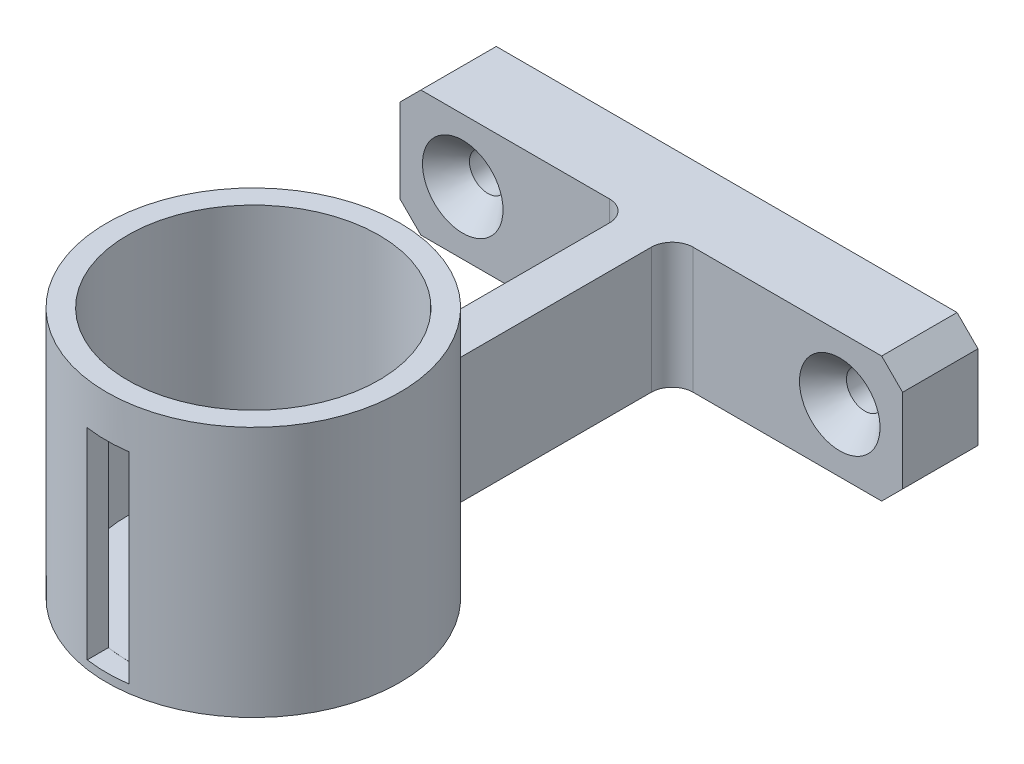
ISO-10303-21;
HEADER;
FILE_DESCRIPTION(('STEP AP214'),'2;1');
FILE_NAME('part.step','',(''),(''),'','','');
FILE_SCHEMA(('AUTOMOTIVE_DESIGN { 1 0 10303 214 1 1 1 1 }'));
ENDSEC;
DATA;
#1=APPLICATION_CONTEXT('core data for automotive mechanical design processes');
#2=APPLICATION_PROTOCOL_DEFINITION('international standard','automotive_design',2000,#1);
#3=PRODUCT_CONTEXT('',#1,'mechanical');
#4=PRODUCT('Part','Part','',(#3));
#5=PRODUCT_RELATED_PRODUCT_CATEGORY('part','',(#4));
#6=PRODUCT_DEFINITION_FORMATION('','',#4);
#7=PRODUCT_DEFINITION_CONTEXT('part definition',#1,'design');
#8=PRODUCT_DEFINITION('design','',#6,#7);
#9=PRODUCT_DEFINITION_SHAPE('','',#8);
#10=(LENGTH_UNIT() NAMED_UNIT(*) SI_UNIT(.MILLI.,.METRE.));
#11=(NAMED_UNIT(*) PLANE_ANGLE_UNIT() SI_UNIT($,.RADIAN.));
#12=(NAMED_UNIT(*) SI_UNIT($,.STERADIAN.) SOLID_ANGLE_UNIT());
#13=UNCERTAINTY_MEASURE_WITH_UNIT(LENGTH_MEASURE(1.E-05),#10,'distance_accuracy_value','');
#14=(GEOMETRIC_REPRESENTATION_CONTEXT(3) GLOBAL_UNCERTAINTY_ASSIGNED_CONTEXT((#13)) GLOBAL_UNIT_ASSIGNED_CONTEXT((#10,
#11,#12)) REPRESENTATION_CONTEXT('',''));
#15=CARTESIAN_POINT('',(0.,0.,0.));
#16=DIRECTION('',(0.,0.,1.));
#17=DIRECTION('',(1.,0.,0.));
#18=AXIS2_PLACEMENT_3D('',#15,#16,#17);
#19=CARTESIAN_POINT('',(30.,-14.,56.5));
#20=DIRECTION('',(0.,-1.,0.));
#21=DIRECTION('',(0.,0.,-1.));
#22=AXIS2_PLACEMENT_3D('',#19,#20,#21);
#23=CYLINDRICAL_SURFACE('',#22,15.);
#24=CARTESIAN_POINT('',(30.,-14.,56.5));
#25=DIRECTION('',(0.,-1.,0.));
#26=DIRECTION('',(0.,0.,-1.));
#27=AXIS2_PLACEMENT_3D('',#24,#25,#26);
#28=CIRCLE('',#27,15.);
#29=CARTESIAN_POINT('',(30.,-14.,41.5));
#30=VERTEX_POINT('',#29);
#31=EDGE_CURVE('E11',#30,#30,#28,.T.);
#32=ORIENTED_EDGE('',*,*,#31,.T.);
#33=EDGE_LOOP('',(#32));
#34=FACE_BOUND('',#33,.T.);
#35=CARTESIAN_POINT('',(30.,-15.,56.5));
#36=DIRECTION('',(0.,-1.,0.));
#37=DIRECTION('',(0.,0.,-1.));
#38=AXIS2_PLACEMENT_3D('',#35,#36,#37);
#39=CIRCLE('',#38,15.);
#40=CARTESIAN_POINT('',(30.,-15.,41.5));
#41=VERTEX_POINT('',#40);
#42=EDGE_CURVE('E57',#41,#41,#39,.T.);
#43=ORIENTED_EDGE('',*,*,#42,.F.);
#44=EDGE_LOOP('',(#43));
#45=FACE_BOUND('',#44,.T.);
#46=ADVANCED_FACE('F54',(#34,#45),#23,.T.);
#47=CARTESIAN_POINT('',(30.,-14.,56.5));
#48=DIRECTION('',(0.,-1.,0.));
#49=DIRECTION('',(0.,0.,-1.));
#50=AXIS2_PLACEMENT_3D('',#47,#48,#49);
#51=PLANE('',#50);
#52=CARTESIAN_POINT('',(30.,-14.,56.5));
#53=DIRECTION('',(0.,-1.,0.));
#54=DIRECTION('',(0.,0.,-1.));
#55=AXIS2_PLACEMENT_3D('',#52,#53,#54);
#56=CIRCLE('',#55,1.5);
#57=CARTESIAN_POINT('',(30.,-14.,55.));
#58=VERTEX_POINT('',#57);
#59=EDGE_CURVE('E67',#58,#58,#56,.T.);
#60=ORIENTED_EDGE('',*,*,#59,.T.);
#61=EDGE_LOOP('',(#60));
#62=FACE_BOUND('',#61,.T.);
#63=ORIENTED_EDGE('',*,*,#31,.F.);
#64=EDGE_LOOP('',(#63));
#65=FACE_BOUND('',#64,.T.);
#66=ADVANCED_FACE('F76',(#62,#65),#51,.F.);
#67=CARTESIAN_POINT('',(30.,-15.,56.5));
#68=DIRECTION('',(0.,-1.,0.));
#69=DIRECTION('',(0.,0.,-1.));
#70=AXIS2_PLACEMENT_3D('',#67,#68,#69);
#71=PLANE('',#70);
#72=CARTESIAN_POINT('',(30.,-15.,56.5));
#73=DIRECTION('',(0.,-1.,0.));
#74=DIRECTION('',(0.,0.,-1.));
#75=AXIS2_PLACEMENT_3D('',#72,#73,#74);
#76=CIRCLE('',#75,1.5);
#77=CARTESIAN_POINT('',(30.,-15.,55.));
#78=VERTEX_POINT('',#77);
#79=EDGE_CURVE('E69',#78,#78,#76,.T.);
#80=ORIENTED_EDGE('',*,*,#79,.F.);
#81=EDGE_LOOP('',(#80));
#82=FACE_BOUND('',#81,.T.);
#83=ORIENTED_EDGE('',*,*,#42,.T.);
#84=EDGE_LOOP('',(#83));
#85=FACE_BOUND('',#84,.T.);
#86=ADVANCED_FACE('F82',(#82,#85),#71,.T.);
#87=CARTESIAN_POINT('',(30.,-14.,56.5));
#88=DIRECTION('',(0.,-1.,0.));
#89=DIRECTION('',(0.,0.,-1.));
#90=AXIS2_PLACEMENT_3D('',#87,#88,#89);
#91=CYLINDRICAL_SURFACE('',#90,1.5);
#92=ORIENTED_EDGE('',*,*,#59,.F.);
#93=EDGE_LOOP('',(#92));
#94=FACE_BOUND('',#93,.T.);
#95=ORIENTED_EDGE('',*,*,#79,.T.);
#96=EDGE_LOOP('',(#95));
#97=FACE_BOUND('',#96,.T.);
#98=ADVANCED_FACE('F79',(#94,#97),#91,.F.);
#99=CLOSED_SHELL('',(#46,#66,#86,#98));
#100=MANIFOLD_SOLID_BREP('B2',#99);
#101=CARTESIAN_POINT('',(0.,0.,9.));
#102=DIRECTION('',(0.,0.,1.));
#103=DIRECTION('',(1.,0.,0.));
#104=AXIS2_PLACEMENT_3D('',#101,#102,#103);
#105=PLANE('',#104);
#106=DIRECTION('',(1.,0.,0.));
#107=VECTOR('',#106,1.);
#108=CARTESIAN_POINT('',(0.,-15.,9.));
#109=LINE('',#108,#107);
#110=CARTESIAN_POINT('',(35.,-15.,9.));
#111=VERTEX_POINT('',#110);
#112=CARTESIAN_POINT('',(57.5,-15.,9.));
#113=VERTEX_POINT('',#112);
#114=EDGE_CURVE('E366',#111,#113,#109,.T.);
#115=ORIENTED_EDGE('',*,*,#114,.T.);
#116=DIRECTION('',(-0.707106781186548,-0.707106781186548,0.));
#117=VECTOR('',#116,1.);
#118=CARTESIAN_POINT('',(36.25,-36.25,9.));
#119=LINE('',#118,#117);
#120=CARTESIAN_POINT('',(60.,-12.5,9.));
#121=VERTEX_POINT('',#120);
#122=EDGE_CURVE('E477',#113,#121,#119,.F.);
#123=ORIENTED_EDGE('',*,*,#122,.T.);
#124=DIRECTION('',(0.,1.,0.));
#125=VECTOR('',#124,1.);
#126=CARTESIAN_POINT('',(60.,0.,9.));
#127=LINE('',#126,#125);
#128=CARTESIAN_POINT('',(60.,-2.49999999999999,9.));
#129=VERTEX_POINT('',#128);
#130=EDGE_CURVE('E371',#121,#129,#127,.T.);
#131=ORIENTED_EDGE('',*,*,#130,.T.);
#132=DIRECTION('',(0.707106781186548,-0.707106781186548,0.));
#133=VECTOR('',#132,1.);
#134=CARTESIAN_POINT('',(28.75,28.75,9.));
#135=LINE('',#134,#133);
#136=CARTESIAN_POINT('',(57.5,0.,9.));
#137=VERTEX_POINT('',#136);
#138=EDGE_CURVE('E474',#129,#137,#135,.F.);
#139=ORIENTED_EDGE('',*,*,#138,.T.);
#140=DIRECTION('',(-1.,0.,0.));
#141=VECTOR('',#140,1.);
#142=CARTESIAN_POINT('',(0.,0.,9.));
#143=LINE('',#142,#141);
#144=CARTESIAN_POINT('',(35.,0.,9.));
#145=VERTEX_POINT('',#144);
#146=EDGE_CURVE('E376',#137,#145,#143,.T.);
#147=ORIENTED_EDGE('',*,*,#146,.T.);
#148=DIRECTION('',(0.,1.,0.));
#149=VECTOR('',#148,1.);
#150=CARTESIAN_POINT('',(35.,0.,9.));
#151=LINE('',#150,#149);
#152=EDGE_CURVE('E415',#145,#111,#151,.F.);
#153=ORIENTED_EDGE('',*,*,#152,.T.);
#154=EDGE_LOOP('',(#115,#123,#131,#139,#147,#153));
#155=FACE_BOUND('',#154,.T.);
#156=CARTESIAN_POINT('',(52.5,-7.5,9.));
#157=DIRECTION('',(0.,0.,-1.));
#158=DIRECTION('',(-1.,0.,0.));
#159=AXIS2_PLACEMENT_3D('',#156,#157,#158);
#160=CIRCLE('',#159,4.80786021344867);
#161=CARTESIAN_POINT('',(47.6921397865513,-7.5,9.));
#162=VERTEX_POINT('',#161);
#163=EDGE_CURVE('E334',#162,#162,#160,.T.);
#164=ORIENTED_EDGE('',*,*,#163,.T.);
#165=EDGE_LOOP('',(#164));
#166=FACE_BOUND('',#165,.T.);
#167=ADVANCED_FACE('F125',(#155,#166),#105,.T.);
#168=CARTESIAN_POINT('',(25.,0.,9.));
#169=VERTEX_POINT('',#168);
#170=CARTESIAN_POINT('',(2.50000000000002,0.,9.));
#171=VERTEX_POINT('',#170);
#172=EDGE_CURVE('E375',#169,#171,#143,.T.);
#173=ORIENTED_EDGE('',*,*,#172,.T.);
#174=DIRECTION('',(0.707106781186548,0.707106781186548,0.));
#175=VECTOR('',#174,1.);
#176=CARTESIAN_POINT('',(1.25000000000001,-1.25000000000001,9.));
#177=LINE('',#176,#175);
#178=CARTESIAN_POINT('',(0.,-2.50000000000002,9.));
#179=VERTEX_POINT('',#178);
#180=EDGE_CURVE('E497',#171,#179,#177,.F.);
#181=ORIENTED_EDGE('',*,*,#180,.T.);
#182=DIRECTION('',(0.,-1.,0.));
#183=VECTOR('',#182,1.);
#184=CARTESIAN_POINT('',(0.,0.,9.));
#185=LINE('',#184,#183);
#186=CARTESIAN_POINT('',(0.,-12.5,9.));
#187=VERTEX_POINT('',#186);
#188=EDGE_CURVE('E362',#179,#187,#185,.T.);
#189=ORIENTED_EDGE('',*,*,#188,.T.);
#190=DIRECTION('',(-0.707106781186546,0.707106781186549,0.));
#191=VECTOR('',#190,1.);
#192=CARTESIAN_POINT('',(-6.24999999999999,-6.24999999999996,9.));
#193=LINE('',#192,#191);
#194=CARTESIAN_POINT('',(2.5,-15.,9.));
#195=VERTEX_POINT('',#194);
#196=EDGE_CURVE('E494',#187,#195,#193,.F.);
#197=ORIENTED_EDGE('',*,*,#196,.T.);
#198=CARTESIAN_POINT('',(25.,-15.,9.));
#199=VERTEX_POINT('',#198);
#200=EDGE_CURVE('E368',#195,#199,#109,.T.);
#201=ORIENTED_EDGE('',*,*,#200,.T.);
#202=DIRECTION('',(0.,-1.,0.));
#203=VECTOR('',#202,1.);
#204=CARTESIAN_POINT('',(25.,0.,9.));
#205=LINE('',#204,#203);
#206=EDGE_CURVE('E418',#199,#169,#205,.F.);
#207=ORIENTED_EDGE('',*,*,#206,.T.);
#208=EDGE_LOOP('',(#173,#181,#189,#197,#201,#207));
#209=FACE_BOUND('',#208,.T.);
#210=CARTESIAN_POINT('',(7.5,-7.5,9.));
#211=DIRECTION('',(0.,0.,1.));
#212=DIRECTION('',(1.,0.,0.));
#213=AXIS2_PLACEMENT_3D('',#210,#211,#212);
#214=CIRCLE('',#213,4.80786021344867);
#215=CARTESIAN_POINT('',(12.3078602134487,-7.5,9.));
#216=VERTEX_POINT('',#215);
#217=EDGE_CURVE('E345',#216,#216,#214,.T.);
#218=ORIENTED_EDGE('',*,*,#217,.F.);
#219=EDGE_LOOP('',(#218));
#220=FACE_BOUND('',#219,.T.);
#221=ADVANCED_FACE('F583',(#209,#220),#105,.T.);
#222=CARTESIAN_POINT('',(0.,0.,0.));
#223=DIRECTION('',(0.,0.,1.));
#224=DIRECTION('',(1.,0.,0.));
#225=AXIS2_PLACEMENT_3D('',#222,#223,#224);
#226=PLANE('',#225);
#227=DIRECTION('',(0.,1.,0.));
#228=VECTOR('',#227,1.);
#229=CARTESIAN_POINT('',(60.,0.,0.));
#230=LINE('',#229,#228);
#231=CARTESIAN_POINT('',(60.,-12.5,0.));
#232=VERTEX_POINT('',#231);
#233=CARTESIAN_POINT('',(60.,-2.49999999999999,0.));
#234=VERTEX_POINT('',#233);
#235=EDGE_CURVE('E387',#232,#234,#230,.T.);
#236=ORIENTED_EDGE('',*,*,#235,.F.);
#237=DIRECTION('',(0.707106781186548,0.707106781186548,0.));
#238=VECTOR('',#237,1.);
#239=CARTESIAN_POINT('',(60.,-12.5,0.));
#240=LINE('',#239,#238);
#241=CARTESIAN_POINT('',(57.5,-15.,0.));
#242=VERTEX_POINT('',#241);
#243=EDGE_CURVE('E464',#232,#242,#240,.F.);
#244=ORIENTED_EDGE('',*,*,#243,.T.);
#245=DIRECTION('',(1.,0.,0.));
#246=VECTOR('',#245,1.);
#247=CARTESIAN_POINT('',(0.,-15.,0.));
#248=LINE('',#247,#246);
#249=CARTESIAN_POINT('',(2.5,-15.,0.));
#250=VERTEX_POINT('',#249);
#251=EDGE_CURVE('E383',#250,#242,#248,.T.);
#252=ORIENTED_EDGE('',*,*,#251,.F.);
#253=DIRECTION('',(0.707106781186546,-0.707106781186549,0.));
#254=VECTOR('',#253,1.);
#255=CARTESIAN_POINT('',(2.5,-15.,0.));
#256=LINE('',#255,#254);
#257=CARTESIAN_POINT('',(0.,-12.5,0.));
#258=VERTEX_POINT('',#257);
#259=EDGE_CURVE('E455',#250,#258,#256,.F.);
#260=ORIENTED_EDGE('',*,*,#259,.T.);
#261=DIRECTION('',(0.,-1.,0.));
#262=VECTOR('',#261,1.);
#263=CARTESIAN_POINT('',(0.,0.,0.));
#264=LINE('',#263,#262);
#265=CARTESIAN_POINT('',(0.,-2.50000000000002,0.));
#266=VERTEX_POINT('',#265);
#267=EDGE_CURVE('E361',#266,#258,#264,.T.);
#268=ORIENTED_EDGE('',*,*,#267,.F.);
#269=DIRECTION('',(-0.707106781186548,-0.707106781186548,0.));
#270=VECTOR('',#269,1.);
#271=CARTESIAN_POINT('',(0.,-2.50000000000002,0.));
#272=LINE('',#271,#270);
#273=CARTESIAN_POINT('',(2.50000000000002,0.,0.));
#274=VERTEX_POINT('',#273);
#275=EDGE_CURVE('E458',#266,#274,#272,.F.);
#276=ORIENTED_EDGE('',*,*,#275,.T.);
#277=DIRECTION('',(-1.,0.,0.));
#278=VECTOR('',#277,1.);
#279=CARTESIAN_POINT('',(0.,0.,0.));
#280=LINE('',#279,#278);
#281=CARTESIAN_POINT('',(57.5,0.,0.));
#282=VERTEX_POINT('',#281);
#283=EDGE_CURVE('E367',#282,#274,#280,.T.);
#284=ORIENTED_EDGE('',*,*,#283,.F.);
#285=DIRECTION('',(-0.707106781186548,0.707106781186548,0.));
#286=VECTOR('',#285,1.);
#287=CARTESIAN_POINT('',(57.5,0.,0.));
#288=LINE('',#287,#286);
#289=EDGE_CURVE('E461',#282,#234,#288,.F.);
#290=ORIENTED_EDGE('',*,*,#289,.T.);
#291=EDGE_LOOP('',(#236,#244,#252,#260,#268,#276,#284,#290));
#292=FACE_BOUND('',#291,.T.);
#293=CARTESIAN_POINT('',(7.5,-7.5,0.));
#294=DIRECTION('',(0.,0.,1.));
#295=DIRECTION('',(1.,0.,0.));
#296=AXIS2_PLACEMENT_3D('',#293,#294,#295);
#297=CIRCLE('',#296,2.2);
#298=CARTESIAN_POINT('',(9.7,-7.5,0.));
#299=VERTEX_POINT('',#298);
#300=EDGE_CURVE('E357',#299,#299,#297,.T.);
#301=ORIENTED_EDGE('',*,*,#300,.T.);
#302=EDGE_LOOP('',(#301));
#303=FACE_BOUND('',#302,.T.);
#304=CARTESIAN_POINT('',(52.5,-7.5,0.));
#305=DIRECTION('',(0.,0.,1.));
#306=DIRECTION('',(-1.,0.,0.));
#307=AXIS2_PLACEMENT_3D('',#304,#305,#306);
#308=CIRCLE('',#307,2.2);
#309=CARTESIAN_POINT('',(50.3,-7.5,0.));
#310=VERTEX_POINT('',#309);
#311=EDGE_CURVE('E353',#310,#310,#308,.T.);
#312=ORIENTED_EDGE('',*,*,#311,.T.);
#313=EDGE_LOOP('',(#312));
#314=FACE_BOUND('',#313,.T.);
#315=ADVANCED_FACE('F549',(#292,#303,#314),#226,.F.);
#316=CARTESIAN_POINT('',(0.,0.,9.));
#317=DIRECTION('',(1.,0.,0.));
#318=DIRECTION('',(0.,1.,0.));
#319=AXIS2_PLACEMENT_3D('',#316,#317,#318);
#320=PLANE('',#319);
#321=ORIENTED_EDGE('',*,*,#188,.F.);
#322=DIRECTION('',(0.,0.,-1.));
#323=VECTOR('',#322,1.);
#324=CARTESIAN_POINT('',(0.,-2.50000000000002,9.));
#325=LINE('',#324,#323);
#326=EDGE_CURVE('E490',#179,#266,#325,.T.);
#327=ORIENTED_EDGE('',*,*,#326,.T.);
#328=ORIENTED_EDGE('',*,*,#267,.T.);
#329=DIRECTION('',(0.,0.,1.));
#330=VECTOR('',#329,1.);
#331=CARTESIAN_POINT('',(0.,-12.5,9.));
#332=LINE('',#331,#330);
#333=EDGE_CURVE('E487',#258,#187,#332,.T.);
#334=ORIENTED_EDGE('',*,*,#333,.T.);
#335=EDGE_LOOP('',(#321,#327,#328,#334));
#336=FACE_BOUND('',#335,.T.);
#337=ADVANCED_FACE('F553',(#336),#320,.F.);
#338=CARTESIAN_POINT('',(0.,-15.,9.));
#339=DIRECTION('',(0.,1.,0.));
#340=DIRECTION('',(0.,0.,1.));
#341=AXIS2_PLACEMENT_3D('',#338,#339,#340);
#342=PLANE('',#341);
#343=CARTESIAN_POINT('',(30.,-15.,56.5));
#344=DIRECTION('',(0.,-1.,0.));
#345=DIRECTION('',(0.,0.,-1.));
#346=AXIS2_PLACEMENT_3D('',#343,#344,#345);
#347=CIRCLE('',#346,15.);
#348=CARTESIAN_POINT('',(30.,-15.,41.5));
#349=VERTEX_POINT('',#348);
#350=EDGE_CURVE('E302',#349,#349,#347,.T.);
#351=ORIENTED_EDGE('',*,*,#350,.F.);
#352=EDGE_LOOP('',(#351));
#353=FACE_BOUND('',#352,.T.);
#354=ORIENTED_EDGE('',*,*,#251,.T.);
#355=DIRECTION('',(0.,0.,1.));
#356=VECTOR('',#355,1.);
#357=CARTESIAN_POINT('',(57.5,-15.,9.));
#358=LINE('',#357,#356);
#359=EDGE_CURVE('E471',#242,#113,#358,.T.);
#360=ORIENTED_EDGE('',*,*,#359,.T.);
#361=ORIENTED_EDGE('',*,*,#114,.F.);
#362=CARTESIAN_POINT('',(35.,-15.,11.5));
#363=DIRECTION('',(0.,1.,0.));
#364=DIRECTION('',(0.,0.,1.));
#365=AXIS2_PLACEMENT_3D('',#362,#363,#364);
#366=CIRCLE('',#365,2.5);
#367=CARTESIAN_POINT('',(32.5,-15.,11.5));
#368=VERTEX_POINT('',#367);
#369=EDGE_CURVE('E438',#111,#368,#366,.T.);
#370=ORIENTED_EDGE('',*,*,#369,.T.);
#371=DIRECTION('',(0.,0.,-1.));
#372=VECTOR('',#371,1.);
#373=CARTESIAN_POINT('',(32.5,-15.,135.811388300842));
#374=LINE('',#373,#372);
#375=CARTESIAN_POINT('',(32.5,-15.,37.1350832689629));
#376=VERTEX_POINT('',#375);
#377=EDGE_CURVE('E321',#376,#368,#374,.T.);
#378=ORIENTED_EDGE('',*,*,#377,.F.);
#379=CARTESIAN_POINT('',(35.,-15.,37.1350832689629));
#380=DIRECTION('',(0.,1.,0.));
#381=DIRECTION('',(0.,0.,1.));
#382=AXIS2_PLACEMENT_3D('',#379,#380,#381);
#383=CIRCLE('',#382,2.5);
#384=CARTESIAN_POINT('',(34.375,-15.,39.5556978603425));
#385=VERTEX_POINT('',#384);
#386=EDGE_CURVE('E428',#376,#385,#383,.T.);
#387=ORIENTED_EDGE('',*,*,#386,.T.);
#388=CARTESIAN_POINT('',(30.,-15.,56.5));
#389=DIRECTION('',(0.,-1.,0.));
#390=DIRECTION('',(0.,0.,-1.));
#391=AXIS2_PLACEMENT_3D('',#388,#389,#390);
#392=CIRCLE('',#391,17.5);
#393=CARTESIAN_POINT('',(25.625,-15.,39.5556978603425));
#394=VERTEX_POINT('',#393);
#395=EDGE_CURVE('E307',#385,#394,#392,.T.);
#396=ORIENTED_EDGE('',*,*,#395,.T.);
#397=CARTESIAN_POINT('',(25.,-15.,37.1350832689629));
#398=DIRECTION('',(0.,1.,0.));
#399=DIRECTION('',(0.,0.,1.));
#400=AXIS2_PLACEMENT_3D('',#397,#398,#399);
#401=CIRCLE('',#400,2.5);
#402=CARTESIAN_POINT('',(27.5,-15.,37.1350832689629));
#403=VERTEX_POINT('',#402);
#404=EDGE_CURVE('E425',#394,#403,#401,.T.);
#405=ORIENTED_EDGE('',*,*,#404,.T.);
#406=DIRECTION('',(0.,0.,-1.));
#407=VECTOR('',#406,1.);
#408=CARTESIAN_POINT('',(27.5,-15.,135.811388300842));
#409=LINE('',#408,#407);
#410=CARTESIAN_POINT('',(27.5,-15.,11.5));
#411=VERTEX_POINT('',#410);
#412=EDGE_CURVE('E330',#403,#411,#409,.T.);
#413=ORIENTED_EDGE('',*,*,#412,.T.);
#414=CARTESIAN_POINT('',(25.,-15.,11.5));
#415=DIRECTION('',(0.,1.,0.));
#416=DIRECTION('',(0.,0.,1.));
#417=AXIS2_PLACEMENT_3D('',#414,#415,#416);
#418=CIRCLE('',#417,2.5);
#419=EDGE_CURVE('E441',#411,#199,#418,.T.);
#420=ORIENTED_EDGE('',*,*,#419,.T.);
#421=ORIENTED_EDGE('',*,*,#200,.F.);
#422=DIRECTION('',(0.,0.,-1.));
#423=VECTOR('',#422,1.);
#424=CARTESIAN_POINT('',(2.5,-15.,9.));
#425=LINE('',#424,#423);
#426=EDGE_CURVE('E467',#195,#250,#425,.T.);
#427=ORIENTED_EDGE('',*,*,#426,.T.);
#428=EDGE_LOOP('',(#354,#360,#361,#370,#378,#387,#396,#405,#413,#420,#421,#427));
#429=FACE_BOUND('',#428,.T.);
#430=ADVANCED_FACE('F532',(#353,#429),#342,.F.);
#431=CARTESIAN_POINT('',(60.,0.,9.));
#432=DIRECTION('',(-1.,0.,0.));
#433=DIRECTION('',(0.,0.,1.));
#434=AXIS2_PLACEMENT_3D('',#431,#432,#433);
#435=PLANE('',#434);
#436=ORIENTED_EDGE('',*,*,#130,.F.);
#437=DIRECTION('',(0.,0.,-1.));
#438=VECTOR('',#437,1.);
#439=CARTESIAN_POINT('',(60.,-12.5,9.));
#440=LINE('',#439,#438);
#441=EDGE_CURVE('E451',#121,#232,#440,.T.);
#442=ORIENTED_EDGE('',*,*,#441,.T.);
#443=ORIENTED_EDGE('',*,*,#235,.T.);
#444=DIRECTION('',(0.,0.,1.));
#445=VECTOR('',#444,1.);
#446=CARTESIAN_POINT('',(60.,-2.49999999999999,9.));
#447=LINE('',#446,#445);
#448=EDGE_CURVE('E448',#234,#129,#447,.T.);
#449=ORIENTED_EDGE('',*,*,#448,.T.);
#450=EDGE_LOOP('',(#436,#442,#443,#449));
#451=FACE_BOUND('',#450,.T.);
#452=ADVANCED_FACE('F569',(#451),#435,.F.);
#453=CARTESIAN_POINT('',(0.,0.,9.));
#454=DIRECTION('',(0.,-1.,0.));
#455=DIRECTION('',(0.,0.,-1.));
#456=AXIS2_PLACEMENT_3D('',#453,#454,#455);
#457=PLANE('',#456);
#458=ORIENTED_EDGE('',*,*,#146,.F.);
#459=DIRECTION('',(0.,0.,-1.));
#460=VECTOR('',#459,1.);
#461=CARTESIAN_POINT('',(57.5,0.,9.));
#462=LINE('',#461,#460);
#463=EDGE_CURVE('E483',#137,#282,#462,.T.);
#464=ORIENTED_EDGE('',*,*,#463,.T.);
#465=ORIENTED_EDGE('',*,*,#283,.T.);
#466=DIRECTION('',(0.,0.,1.));
#467=VECTOR('',#466,1.);
#468=CARTESIAN_POINT('',(2.50000000000002,0.,9.));
#469=LINE('',#468,#467);
#470=EDGE_CURVE('E480',#274,#171,#469,.T.);
#471=ORIENTED_EDGE('',*,*,#470,.T.);
#472=ORIENTED_EDGE('',*,*,#172,.F.);
#473=CARTESIAN_POINT('',(25.,0.,11.5));
#474=DIRECTION('',(0.,-1.,0.));
#475=DIRECTION('',(0.,0.,-1.));
#476=AXIS2_PLACEMENT_3D('',#473,#474,#475);
#477=CIRCLE('',#476,2.5);
#478=CARTESIAN_POINT('',(27.5,0.,11.5));
#479=VERTEX_POINT('',#478);
#480=EDGE_CURVE('E445',#169,#479,#477,.T.);
#481=ORIENTED_EDGE('',*,*,#480,.T.);
#482=DIRECTION('',(0.,0.,-1.));
#483=VECTOR('',#482,1.);
#484=CARTESIAN_POINT('',(27.5,0.,135.811388300842));
#485=LINE('',#484,#483);
#486=CARTESIAN_POINT('',(27.5,0.,37.1350832689629));
#487=VERTEX_POINT('',#486);
#488=EDGE_CURVE('E326',#487,#479,#485,.T.);
#489=ORIENTED_EDGE('',*,*,#488,.F.);
#490=CARTESIAN_POINT('',(25.,0.,37.1350832689629));
#491=DIRECTION('',(0.,-1.,0.));
#492=DIRECTION('',(0.,0.,-1.));
#493=AXIS2_PLACEMENT_3D('',#490,#491,#492);
#494=CIRCLE('',#493,2.5);
#495=CARTESIAN_POINT('',(25.625,0.,39.5556978603425));
#496=VERTEX_POINT('',#495);
#497=EDGE_CURVE('E421',#487,#496,#494,.T.);
#498=ORIENTED_EDGE('',*,*,#497,.T.);
#499=CARTESIAN_POINT('',(30.,0.,56.5));
#500=DIRECTION('',(0.,-1.,0.));
#501=DIRECTION('',(0.,0.,-1.));
#502=AXIS2_PLACEMENT_3D('',#499,#500,#501);
#503=CIRCLE('',#502,17.5);
#504=CARTESIAN_POINT('',(34.375,0.,39.5556978603425));
#505=VERTEX_POINT('',#504);
#506=EDGE_CURVE('E315',#496,#505,#503,.T.);
#507=ORIENTED_EDGE('',*,*,#506,.T.);
#508=CARTESIAN_POINT('',(35.,0.,37.1350832689629));
#509=DIRECTION('',(0.,-1.,0.));
#510=DIRECTION('',(0.,0.,-1.));
#511=AXIS2_PLACEMENT_3D('',#508,#509,#510);
#512=CIRCLE('',#511,2.5);
#513=CARTESIAN_POINT('',(32.5,0.,37.1350832689629));
#514=VERTEX_POINT('',#513);
#515=EDGE_CURVE('E431',#505,#514,#512,.T.);
#516=ORIENTED_EDGE('',*,*,#515,.T.);
#517=DIRECTION('',(0.,0.,-1.));
#518=VECTOR('',#517,1.);
#519=CARTESIAN_POINT('',(32.5,0.,135.811388300842));
#520=LINE('',#519,#518);
#521=CARTESIAN_POINT('',(32.5,0.,11.5));
#522=VERTEX_POINT('',#521);
#523=EDGE_CURVE('E322',#514,#522,#520,.T.);
#524=ORIENTED_EDGE('',*,*,#523,.T.);
#525=CARTESIAN_POINT('',(35.,0.,11.5));
#526=DIRECTION('',(0.,-1.,0.));
#527=DIRECTION('',(0.,0.,-1.));
#528=AXIS2_PLACEMENT_3D('',#525,#526,#527);
#529=CIRCLE('',#528,2.5);
#530=EDGE_CURVE('E434',#522,#145,#529,.T.);
#531=ORIENTED_EDGE('',*,*,#530,.T.);
#532=EDGE_LOOP('',(#458,#464,#465,#471,#472,#481,#489,#498,#507,#516,#524,#531));
#533=FACE_BOUND('',#532,.T.);
#534=ADVANCED_FACE('F525',(#533),#457,.F.);
#535=CARTESIAN_POINT('',(7.5,-7.5,9.));
#536=DIRECTION('',(0.,0.,-1.));
#537=DIRECTION('',(-1.,0.,0.));
#538=AXIS2_PLACEMENT_3D('',#535,#536,#537);
#539=CYLINDRICAL_SURFACE('',#538,2.2);
#540=CARTESIAN_POINT('',(7.5,-7.5,6.));
#541=DIRECTION('',(0.,0.,1.));
#542=DIRECTION('',(1.,0.,0.));
#543=AXIS2_PLACEMENT_3D('',#540,#541,#542);
#544=CIRCLE('',#543,2.2);
#545=CARTESIAN_POINT('',(9.7,-7.5,6.));
#546=VERTEX_POINT('',#545);
#547=EDGE_CURVE('E349',#546,#546,#544,.T.);
#548=ORIENTED_EDGE('',*,*,#547,.T.);
#549=EDGE_LOOP('',(#548));
#550=FACE_BOUND('',#549,.T.);
#551=ORIENTED_EDGE('',*,*,#300,.F.);
#552=EDGE_LOOP('',(#551));
#553=FACE_BOUND('',#552,.T.);
#554=ADVANCED_FACE('F601',(#550,#553),#539,.F.);
#555=CARTESIAN_POINT('',(52.5,-7.5,9.));
#556=DIRECTION('',(0.,0.,-1.));
#557=DIRECTION('',(-1.,0.,0.));
#558=AXIS2_PLACEMENT_3D('',#555,#556,#557);
#559=CYLINDRICAL_SURFACE('',#558,2.2);
#560=CARTESIAN_POINT('',(52.5,-7.5,6.));
#561=DIRECTION('',(0.,0.,-1.));
#562=DIRECTION('',(-1.,0.,0.));
#563=AXIS2_PLACEMENT_3D('',#560,#561,#562);
#564=CIRCLE('',#563,2.2);
#565=CARTESIAN_POINT('',(50.3,-7.5,6.));
#566=VERTEX_POINT('',#565);
#567=EDGE_CURVE('E341',#566,#566,#564,.T.);
#568=ORIENTED_EDGE('',*,*,#567,.F.);
#569=EDGE_LOOP('',(#568));
#570=FACE_BOUND('',#569,.T.);
#571=ORIENTED_EDGE('',*,*,#311,.F.);
#572=EDGE_LOOP('',(#571));
#573=FACE_BOUND('',#572,.T.);
#574=ADVANCED_FACE('F592',(#570,#573),#559,.F.);
#575=CARTESIAN_POINT('',(7.5,-7.5,9.));
#576=DIRECTION('',(0.,0.,1.));
#577=DIRECTION('',(1.,0.,0.));
#578=AXIS2_PLACEMENT_3D('',#575,#576,#577);
#579=CONICAL_SURFACE('',#578,4.80786021344867,0.715584993317673);
#580=ORIENTED_EDGE('',*,*,#547,.F.);
#581=EDGE_LOOP('',(#580));
#582=FACE_BOUND('',#581,.T.);
#583=ORIENTED_EDGE('',*,*,#217,.T.);
#584=EDGE_LOOP('',(#583));
#585=FACE_BOUND('',#584,.T.);
#586=ADVANCED_FACE('F589',(#582,#585),#579,.F.);
#587=CARTESIAN_POINT('',(52.5,-7.5,9.));
#588=DIRECTION('',(0.,0.,1.));
#589=DIRECTION('',(-1.,0.,0.));
#590=AXIS2_PLACEMENT_3D('',#587,#588,#589);
#591=CONICAL_SURFACE('',#590,4.80786021344867,0.715584993317673);
#592=ORIENTED_EDGE('',*,*,#567,.T.);
#593=EDGE_LOOP('',(#592));
#594=FACE_BOUND('',#593,.T.);
#595=ORIENTED_EDGE('',*,*,#163,.F.);
#596=EDGE_LOOP('',(#595));
#597=FACE_BOUND('',#596,.T.);
#598=ADVANCED_FACE('F591',(#594,#597),#591,.F.);
#599=CARTESIAN_POINT('',(32.5,0.,135.811388300842));
#600=DIRECTION('',(-1.,0.,0.));
#601=DIRECTION('',(0.,0.,1.));
#602=AXIS2_PLACEMENT_3D('',#599,#600,#601);
#603=PLANE('',#602);
#604=ORIENTED_EDGE('',*,*,#523,.F.);
#605=DIRECTION('',(0.,-1.,0.));
#606=VECTOR('',#605,1.);
#607=CARTESIAN_POINT('',(32.5,0.,37.1350832689629));
#608=LINE('',#607,#606);
#609=EDGE_CURVE('E412',#514,#376,#608,.T.);
#610=ORIENTED_EDGE('',*,*,#609,.T.);
#611=ORIENTED_EDGE('',*,*,#377,.T.);
#612=DIRECTION('',(0.,1.,0.));
#613=VECTOR('',#612,1.);
#614=CARTESIAN_POINT('',(32.5,0.,11.5));
#615=LINE('',#614,#613);
#616=EDGE_CURVE('E408',#368,#522,#615,.T.);
#617=ORIENTED_EDGE('',*,*,#616,.T.);
#618=EDGE_LOOP('',(#604,#610,#611,#617));
#619=FACE_BOUND('',#618,.T.);
#620=ADVANCED_FACE('F598',(#619),#603,.F.);
#621=CARTESIAN_POINT('',(27.5,0.,135.811388300842));
#622=DIRECTION('',(1.,0.,0.));
#623=DIRECTION('',(0.,0.,-1.));
#624=AXIS2_PLACEMENT_3D('',#621,#622,#623);
#625=PLANE('',#624);
#626=ORIENTED_EDGE('',*,*,#412,.F.);
#627=DIRECTION('',(0.,-1.,0.));
#628=VECTOR('',#627,1.);
#629=CARTESIAN_POINT('',(27.5,0.,37.1350832689629));
#630=LINE('',#629,#628);
#631=EDGE_CURVE('E397',#403,#487,#630,.F.);
#632=ORIENTED_EDGE('',*,*,#631,.T.);
#633=ORIENTED_EDGE('',*,*,#488,.T.);
#634=DIRECTION('',(0.,-1.,0.));
#635=VECTOR('',#634,1.);
#636=CARTESIAN_POINT('',(27.5,0.,11.5));
#637=LINE('',#636,#635);
#638=EDGE_CURVE('E379',#479,#411,#637,.T.);
#639=ORIENTED_EDGE('',*,*,#638,.T.);
#640=EDGE_LOOP('',(#626,#632,#633,#639));
#641=FACE_BOUND('',#640,.T.);
#642=ADVANCED_FACE('F514',(#641),#625,.F.);
#643=CARTESIAN_POINT('',(30.,15.,56.5));
#644=DIRECTION('',(0.,-1.,0.));
#645=DIRECTION('',(0.,0.,-1.));
#646=AXIS2_PLACEMENT_3D('',#643,#644,#645);
#647=CYLINDRICAL_SURFACE('',#646,17.5);
#648=CARTESIAN_POINT('',(30.,-14.,56.5));
#649=DIRECTION('',(0.,-1.,0.));
#650=DIRECTION('',(0.,0.,-1.));
#651=AXIS2_PLACEMENT_3D('',#648,#649,#650);
#652=CIRCLE('',#651,17.5);
#653=CARTESIAN_POINT('',(27.5,-14.,73.8205080756888));
#654=VERTEX_POINT('',#653);
#655=CARTESIAN_POINT('',(32.5,-14.,73.8205080756888));
#656=VERTEX_POINT('',#655);
#657=EDGE_CURVE('E294',#654,#656,#652,.F.);
#658=ORIENTED_EDGE('',*,*,#657,.F.);
#659=DIRECTION('',(0.,-1.,0.));
#660=VECTOR('',#659,1.);
#661=CARTESIAN_POINT('',(27.5,15.,73.8205080756888));
#662=LINE('',#661,#660);
#663=CARTESIAN_POINT('',(27.5,10.,73.8205080756888));
#664=VERTEX_POINT('',#663);
#665=EDGE_CURVE('E275',#664,#654,#662,.T.);
#666=ORIENTED_EDGE('',*,*,#665,.F.);
#667=CARTESIAN_POINT('',(30.,10.,56.5));
#668=DIRECTION('',(0.,-1.,0.));
#669=DIRECTION('',(0.,0.,-1.));
#670=AXIS2_PLACEMENT_3D('',#667,#668,#669);
#671=CIRCLE('',#670,17.5);
#672=CARTESIAN_POINT('',(32.5,10.,73.8205080756888));
#673=VERTEX_POINT('',#672);
#674=EDGE_CURVE('E290',#664,#673,#671,.F.);
#675=ORIENTED_EDGE('',*,*,#674,.T.);
#676=DIRECTION('',(0.,-1.,0.));
#677=VECTOR('',#676,1.);
#678=CARTESIAN_POINT('',(32.5,15.,73.8205080756888));
#679=LINE('',#678,#677);
#680=EDGE_CURVE('E299',#656,#673,#679,.F.);
#681=ORIENTED_EDGE('',*,*,#680,.F.);
#682=EDGE_LOOP('',(#658,#666,#675,#681));
#683=FACE_BOUND('',#682,.T.);
#684=CARTESIAN_POINT('',(30.,15.,56.5));
#685=DIRECTION('',(0.,-1.,0.));
#686=DIRECTION('',(0.,0.,-1.));
#687=AXIS2_PLACEMENT_3D('',#684,#685,#686);
#688=CIRCLE('',#687,17.5);
#689=CARTESIAN_POINT('',(30.,15.,39.));
#690=VERTEX_POINT('',#689);
#691=EDGE_CURVE('E311',#690,#690,#688,.T.);
#692=ORIENTED_EDGE('',*,*,#691,.T.);
#693=EDGE_LOOP('',(#692));
#694=FACE_BOUND('',#693,.T.);
#695=ORIENTED_EDGE('',*,*,#506,.F.);
#696=DIRECTION('',(0.,-1.,0.));
#697=VECTOR('',#696,1.);
#698=CARTESIAN_POINT('',(25.625,15.,39.5556978603425));
#699=LINE('',#698,#697);
#700=EDGE_CURVE('E405',#496,#394,#699,.T.);
#701=ORIENTED_EDGE('',*,*,#700,.T.);
#702=ORIENTED_EDGE('',*,*,#395,.F.);
#703=DIRECTION('',(0.,-1.,0.));
#704=VECTOR('',#703,1.);
#705=CARTESIAN_POINT('',(34.375,15.,39.5556978603425));
#706=LINE('',#705,#704);
#707=EDGE_CURVE('E401',#385,#505,#706,.F.);
#708=ORIENTED_EDGE('',*,*,#707,.T.);
#709=EDGE_LOOP('',(#695,#701,#702,#708));
#710=FACE_BOUND('',#709,.T.);
#711=ADVANCED_FACE('F510',(#683,#694,#710),#647,.T.);
#712=CARTESIAN_POINT('',(30.,15.,56.5));
#713=DIRECTION('',(0.,-1.,0.));
#714=DIRECTION('',(0.,0.,-1.));
#715=AXIS2_PLACEMENT_3D('',#712,#713,#714);
#716=PLANE('',#715);
#717=CARTESIAN_POINT('',(30.,15.,56.5));
#718=DIRECTION('',(0.,-1.,0.));
#719=DIRECTION('',(0.,0.,-1.));
#720=AXIS2_PLACEMENT_3D('',#717,#718,#719);
#721=CIRCLE('',#720,15.);
#722=CARTESIAN_POINT('',(30.,15.,41.5));
#723=VERTEX_POINT('',#722);
#724=EDGE_CURVE('E303',#723,#723,#721,.T.);
#725=ORIENTED_EDGE('',*,*,#724,.T.);
#726=EDGE_LOOP('',(#725));
#727=FACE_BOUND('',#726,.T.);
#728=ORIENTED_EDGE('',*,*,#691,.F.);
#729=EDGE_LOOP('',(#728));
#730=FACE_BOUND('',#729,.T.);
#731=ADVANCED_FACE('F513',(#727,#730),#716,.F.);
#732=CARTESIAN_POINT('',(30.,15.,56.5));
#733=DIRECTION('',(0.,-1.,0.));
#734=DIRECTION('',(0.,0.,-1.));
#735=AXIS2_PLACEMENT_3D('',#732,#733,#734);
#736=CYLINDRICAL_SURFACE('',#735,15.);
#737=DIRECTION('',(0.,-1.,0.));
#738=VECTOR('',#737,1.);
#739=CARTESIAN_POINT('',(27.5,22.4330343736593,71.290199457749));
#740=LINE('',#739,#738);
#741=CARTESIAN_POINT('',(27.5,10.,71.290199457749));
#742=VERTEX_POINT('',#741);
#743=CARTESIAN_POINT('',(27.5,-14.,71.290199457749));
#744=VERTEX_POINT('',#743);
#745=EDGE_CURVE('E150',#742,#744,#740,.T.);
#746=ORIENTED_EDGE('',*,*,#745,.T.);
#747=CARTESIAN_POINT('',(30.,-14.,56.5));
#748=DIRECTION('',(0.,-1.,0.));
#749=DIRECTION('',(0.,0.,-1.));
#750=AXIS2_PLACEMENT_3D('',#747,#748,#749);
#751=CIRCLE('',#750,15.);
#752=CARTESIAN_POINT('',(32.5,-14.,71.290199457749));
#753=VERTEX_POINT('',#752);
#754=EDGE_CURVE('E52',#744,#753,#751,.F.);
#755=ORIENTED_EDGE('',*,*,#754,.T.);
#756=DIRECTION('',(0.,-1.,0.));
#757=VECTOR('',#756,1.);
#758=CARTESIAN_POINT('',(32.5,22.4330343736593,71.290199457749));
#759=LINE('',#758,#757);
#760=CARTESIAN_POINT('',(32.5,10.,71.290199457749));
#761=VERTEX_POINT('',#760);
#762=EDGE_CURVE('E282',#761,#753,#759,.T.);
#763=ORIENTED_EDGE('',*,*,#762,.F.);
#764=CARTESIAN_POINT('',(30.,10.,56.5));
#765=DIRECTION('',(0.,-1.,0.));
#766=DIRECTION('',(0.,0.,-1.));
#767=AXIS2_PLACEMENT_3D('',#764,#765,#766);
#768=CIRCLE('',#767,15.);
#769=EDGE_CURVE('E135',#742,#761,#768,.F.);
#770=ORIENTED_EDGE('',*,*,#769,.F.);
#771=EDGE_LOOP('',(#746,#755,#763,#770));
#772=FACE_BOUND('',#771,.T.);
#773=ORIENTED_EDGE('',*,*,#724,.F.);
#774=EDGE_LOOP('',(#773));
#775=FACE_BOUND('',#774,.T.);
#776=ORIENTED_EDGE('',*,*,#350,.T.);
#777=EDGE_LOOP('',(#776));
#778=FACE_BOUND('',#777,.T.);
#779=ADVANCED_FACE('F279',(#772,#775,#778),#736,.F.);
#780=CARTESIAN_POINT('',(25.,15.,37.1350832689629));
#781=DIRECTION('',(0.,-1.,0.));
#782=DIRECTION('',(0.,0.,-1.));
#783=AXIS2_PLACEMENT_3D('',#780,#781,#782);
#784=CYLINDRICAL_SURFACE('',#783,2.5);
#785=ORIENTED_EDGE('',*,*,#404,.F.);
#786=ORIENTED_EDGE('',*,*,#700,.F.);
#787=ORIENTED_EDGE('',*,*,#497,.F.);
#788=ORIENTED_EDGE('',*,*,#631,.F.);
#789=EDGE_LOOP('',(#785,#786,#787,#788));
#790=FACE_BOUND('',#789,.T.);
#791=ADVANCED_FACE('F529',(#790),#784,.F.);
#792=CARTESIAN_POINT('',(35.,15.,37.1350832689629));
#793=DIRECTION('',(0.,-1.,0.));
#794=DIRECTION('',(0.,0.,-1.));
#795=AXIS2_PLACEMENT_3D('',#792,#793,#794);
#796=CYLINDRICAL_SURFACE('',#795,2.5);
#797=ORIENTED_EDGE('',*,*,#515,.F.);
#798=ORIENTED_EDGE('',*,*,#707,.F.);
#799=ORIENTED_EDGE('',*,*,#386,.F.);
#800=ORIENTED_EDGE('',*,*,#609,.F.);
#801=EDGE_LOOP('',(#797,#798,#799,#800));
#802=FACE_BOUND('',#801,.T.);
#803=ADVANCED_FACE('F622',(#802),#796,.F.);
#804=CARTESIAN_POINT('',(35.,0.,11.5));
#805=DIRECTION('',(0.,1.,0.));
#806=DIRECTION('',(0.,0.,1.));
#807=AXIS2_PLACEMENT_3D('',#804,#805,#806);
#808=CYLINDRICAL_SURFACE('',#807,2.5);
#809=ORIENTED_EDGE('',*,*,#369,.F.);
#810=ORIENTED_EDGE('',*,*,#152,.F.);
#811=ORIENTED_EDGE('',*,*,#530,.F.);
#812=ORIENTED_EDGE('',*,*,#616,.F.);
#813=EDGE_LOOP('',(#809,#810,#811,#812));
#814=FACE_BOUND('',#813,.T.);
#815=ADVANCED_FACE('F625',(#814),#808,.F.);
#816=CARTESIAN_POINT('',(25.,0.,11.5));
#817=DIRECTION('',(0.,-1.,0.));
#818=DIRECTION('',(0.,0.,-1.));
#819=AXIS2_PLACEMENT_3D('',#816,#817,#818);
#820=CYLINDRICAL_SURFACE('',#819,2.5);
#821=ORIENTED_EDGE('',*,*,#480,.F.);
#822=ORIENTED_EDGE('',*,*,#206,.F.);
#823=ORIENTED_EDGE('',*,*,#419,.F.);
#824=ORIENTED_EDGE('',*,*,#638,.F.);
#825=EDGE_LOOP('',(#821,#822,#823,#824));
#826=FACE_BOUND('',#825,.T.);
#827=ADVANCED_FACE('F537',(#826),#820,.F.);
#828=CARTESIAN_POINT('',(60.,-12.5,9.));
#829=DIRECTION('',(-0.707106781186547,0.707106781186547,0.));
#830=DIRECTION('',(0.,0.,-1.));
#831=AXIS2_PLACEMENT_3D('',#828,#829,#830);
#832=PLANE('',#831);
#833=ORIENTED_EDGE('',*,*,#122,.F.);
#834=ORIENTED_EDGE('',*,*,#359,.F.);
#835=ORIENTED_EDGE('',*,*,#243,.F.);
#836=ORIENTED_EDGE('',*,*,#441,.F.);
#837=EDGE_LOOP('',(#833,#834,#835,#836));
#838=FACE_BOUND('',#837,.T.);
#839=ADVANCED_FACE('F573',(#838),#832,.F.);
#840=CARTESIAN_POINT('',(57.5,0.,9.));
#841=DIRECTION('',(-0.707106781186548,-0.707106781186548,0.));
#842=DIRECTION('',(0.,0.,-1.));
#843=AXIS2_PLACEMENT_3D('',#840,#841,#842);
#844=PLANE('',#843);
#845=ORIENTED_EDGE('',*,*,#138,.F.);
#846=ORIENTED_EDGE('',*,*,#448,.F.);
#847=ORIENTED_EDGE('',*,*,#289,.F.);
#848=ORIENTED_EDGE('',*,*,#463,.F.);
#849=EDGE_LOOP('',(#845,#846,#847,#848));
#850=FACE_BOUND('',#849,.T.);
#851=ADVANCED_FACE('F565',(#850),#844,.F.);
#852=CARTESIAN_POINT('',(0.,-2.50000000000002,9.));
#853=DIRECTION('',(0.707106781186547,-0.707106781186547,0.));
#854=DIRECTION('',(0.,0.,-1.));
#855=AXIS2_PLACEMENT_3D('',#852,#853,#854);
#856=PLANE('',#855);
#857=ORIENTED_EDGE('',*,*,#180,.F.);
#858=ORIENTED_EDGE('',*,*,#470,.F.);
#859=ORIENTED_EDGE('',*,*,#275,.F.);
#860=ORIENTED_EDGE('',*,*,#326,.F.);
#861=EDGE_LOOP('',(#857,#858,#859,#860));
#862=FACE_BOUND('',#861,.T.);
#863=ADVANCED_FACE('F557',(#862),#856,.F.);
#864=CARTESIAN_POINT('',(2.5,-15.,9.));
#865=DIRECTION('',(0.707106781186549,0.707106781186545,0.));
#866=DIRECTION('',(0.,0.,-1.));
#867=AXIS2_PLACEMENT_3D('',#864,#865,#866);
#868=PLANE('',#867);
#869=ORIENTED_EDGE('',*,*,#196,.F.);
#870=ORIENTED_EDGE('',*,*,#333,.F.);
#871=ORIENTED_EDGE('',*,*,#259,.F.);
#872=ORIENTED_EDGE('',*,*,#426,.F.);
#873=EDGE_LOOP('',(#869,#870,#871,#872));
#874=FACE_BOUND('',#873,.T.);
#875=ADVANCED_FACE('F128',(#874),#868,.F.);
#876=CARTESIAN_POINT('',(0.,-14.,0.));
#877=DIRECTION('',(0.,-1.,0.));
#878=DIRECTION('',(0.,0.,-1.));
#879=AXIS2_PLACEMENT_3D('',#876,#877,#878);
#880=PLANE('',#879);
#881=ORIENTED_EDGE('',*,*,#657,.T.);
#882=DIRECTION('',(0.,0.,1.));
#883=VECTOR('',#882,1.);
#884=CARTESIAN_POINT('',(32.5,-14.,71.290199457749));
#885=LINE('',#884,#883);
#886=EDGE_CURVE('E270',#753,#656,#885,.T.);
#887=ORIENTED_EDGE('',*,*,#886,.F.);
#888=ORIENTED_EDGE('',*,*,#754,.F.);
#889=DIRECTION('',(0.,0.,-1.));
#890=VECTOR('',#889,1.);
#891=CARTESIAN_POINT('',(27.5,-14.,71.290199457749));
#892=LINE('',#891,#890);
#893=EDGE_CURVE('E267',#654,#744,#892,.T.);
#894=ORIENTED_EDGE('',*,*,#893,.F.);
#895=EDGE_LOOP('',(#881,#887,#888,#894));
#896=FACE_BOUND('',#895,.T.);
#897=ADVANCED_FACE('F266',(#896),#880,.F.);
#898=CARTESIAN_POINT('',(30.,10.,56.5));
#899=DIRECTION('',(0.,-1.,0.));
#900=DIRECTION('',(0.,0.,-1.));
#901=AXIS2_PLACEMENT_3D('',#898,#899,#900);
#902=PLANE('',#901);
#903=DIRECTION('',(0.,0.,1.));
#904=VECTOR('',#903,1.);
#905=CARTESIAN_POINT('',(27.5,10.,71.290199457749));
#906=LINE('',#905,#904);
#907=EDGE_CURVE('E287',#742,#664,#906,.T.);
#908=ORIENTED_EDGE('',*,*,#907,.F.);
#909=ORIENTED_EDGE('',*,*,#769,.T.);
#910=DIRECTION('',(0.,0.,-1.));
#911=VECTOR('',#910,1.);
#912=CARTESIAN_POINT('',(32.5,10.,71.290199457749));
#913=LINE('',#912,#911);
#914=EDGE_CURVE('E142',#673,#761,#913,.T.);
#915=ORIENTED_EDGE('',*,*,#914,.F.);
#916=ORIENTED_EDGE('',*,*,#674,.F.);
#917=EDGE_LOOP('',(#908,#909,#915,#916));
#918=FACE_BOUND('',#917,.T.);
#919=ADVANCED_FACE('F499',(#918),#902,.T.);
#920=CARTESIAN_POINT('',(32.5,22.4330343736593,71.290199457749));
#921=DIRECTION('',(1.,0.,0.));
#922=DIRECTION('',(0.,0.,-1.));
#923=AXIS2_PLACEMENT_3D('',#920,#921,#922);
#924=PLANE('',#923);
#925=ORIENTED_EDGE('',*,*,#680,.T.);
#926=ORIENTED_EDGE('',*,*,#914,.T.);
#927=ORIENTED_EDGE('',*,*,#762,.T.);
#928=ORIENTED_EDGE('',*,*,#886,.T.);
#929=EDGE_LOOP('',(#925,#926,#927,#928));
#930=FACE_BOUND('',#929,.T.);
#931=ADVANCED_FACE('F501',(#930),#924,.F.);
#932=CARTESIAN_POINT('',(27.5,22.4330343736593,71.290199457749));
#933=DIRECTION('',(-1.,0.,0.));
#934=DIRECTION('',(0.,0.,1.));
#935=AXIS2_PLACEMENT_3D('',#932,#933,#934);
#936=PLANE('',#935);
#937=ORIENTED_EDGE('',*,*,#665,.T.);
#938=ORIENTED_EDGE('',*,*,#893,.T.);
#939=ORIENTED_EDGE('',*,*,#745,.F.);
#940=ORIENTED_EDGE('',*,*,#907,.T.);
#941=EDGE_LOOP('',(#937,#938,#939,#940));
#942=FACE_BOUND('',#941,.T.);
#943=ADVANCED_FACE('F273',(#942),#936,.F.);
#944=CLOSED_SHELL('',(#167,#221,#315,#337,#430,#452,#534,#554,#574,#586,#598,#620,#642,#711,
#731,#779,#791,#803,#815,#827,#839,#851,#863,#875,#897,#919,#931,#943));
#945=MANIFOLD_SOLID_BREP('B6',#944);
#946=ADVANCED_BREP_SHAPE_REPRESENTATION('',(#18,#100,#945),#14);
#947=SHAPE_DEFINITION_REPRESENTATION(#9,#946);
ENDSEC;
END-ISO-10303-21;
